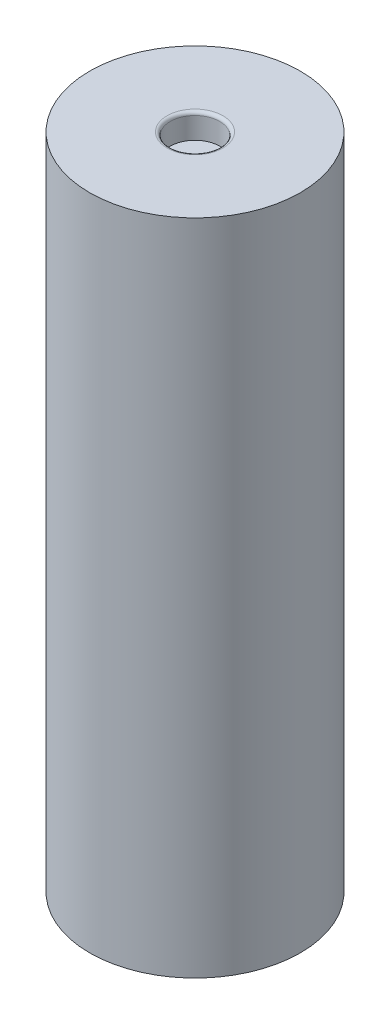
ISO-10303-21;
HEADER;
FILE_DESCRIPTION(('STEP AP214'),'2;1');
FILE_NAME('part.step','',(''),(''),'','','');
FILE_SCHEMA(('AUTOMOTIVE_DESIGN { 1 0 10303 214 1 1 1 1 }'));
ENDSEC;
DATA;
#1=APPLICATION_CONTEXT('core data for automotive mechanical design processes');
#2=APPLICATION_PROTOCOL_DEFINITION('international standard','automotive_design',2000,#1);
#3=PRODUCT_CONTEXT('',#1,'mechanical');
#4=PRODUCT('Part','Part','',(#3));
#5=PRODUCT_RELATED_PRODUCT_CATEGORY('part','',(#4));
#6=PRODUCT_DEFINITION_FORMATION('','',#4);
#7=PRODUCT_DEFINITION_CONTEXT('part definition',#1,'design');
#8=PRODUCT_DEFINITION('design','',#6,#7);
#9=PRODUCT_DEFINITION_SHAPE('','',#8);
#10=(LENGTH_UNIT() NAMED_UNIT(*) SI_UNIT(.MILLI.,.METRE.));
#11=(NAMED_UNIT(*) PLANE_ANGLE_UNIT() SI_UNIT($,.RADIAN.));
#12=(NAMED_UNIT(*) SI_UNIT($,.STERADIAN.) SOLID_ANGLE_UNIT());
#13=UNCERTAINTY_MEASURE_WITH_UNIT(LENGTH_MEASURE(1.E-05),#10,'distance_accuracy_value','');
#14=(GEOMETRIC_REPRESENTATION_CONTEXT(3) GLOBAL_UNCERTAINTY_ASSIGNED_CONTEXT((#13)) GLOBAL_UNIT_ASSIGNED_CONTEXT((#10,
#11,#12)) REPRESENTATION_CONTEXT('',''));
#15=CARTESIAN_POINT('',(0.,0.,0.));
#16=DIRECTION('',(0.,0.,1.));
#17=DIRECTION('',(1.,0.,0.));
#18=AXIS2_PLACEMENT_3D('',#15,#16,#17);
#19=CARTESIAN_POINT('',(0.,40.,0.));
#20=DIRECTION('',(0.,-1.,0.));
#21=DIRECTION('',(0.,0.,-1.));
#22=AXIS2_PLACEMENT_3D('',#19,#20,#21);
#23=CYLINDRICAL_SURFACE('',#22,6.4);
#24=CARTESIAN_POINT('',(0.,40.,0.));
#25=DIRECTION('',(0.,1.,0.));
#26=DIRECTION('',(0.,0.,1.));
#27=AXIS2_PLACEMENT_3D('',#24,#25,#26);
#28=CIRCLE('',#27,6.4);
#29=CARTESIAN_POINT('',(0.,40.,6.4));
#30=VERTEX_POINT('',#29);
#31=EDGE_CURVE('E67',#30,#30,#28,.T.);
#32=ORIENTED_EDGE('',*,*,#31,.F.);
#33=EDGE_LOOP('',(#32));
#34=FACE_BOUND('',#33,.T.);
#35=CARTESIAN_POINT('',(0.,0.,0.));
#36=DIRECTION('',(0.,1.,0.));
#37=DIRECTION('',(0.,0.,1.));
#38=AXIS2_PLACEMENT_3D('',#35,#36,#37);
#39=CIRCLE('',#38,6.4);
#40=CARTESIAN_POINT('',(0.,0.,6.4));
#41=VERTEX_POINT('',#40);
#42=EDGE_CURVE('E68',#41,#41,#39,.T.);
#43=ORIENTED_EDGE('',*,*,#42,.T.);
#44=EDGE_LOOP('',(#43));
#45=FACE_BOUND('',#44,.T.);
#46=ADVANCED_FACE('F43',(#34,#45),#23,.T.);
#47=CARTESIAN_POINT('',(0.,40.,0.));
#48=DIRECTION('',(0.,1.,0.));
#49=DIRECTION('',(0.,0.,1.));
#50=AXIS2_PLACEMENT_3D('',#47,#48,#49);
#51=PLANE('',#50);
#52=CARTESIAN_POINT('',(0.,40.,0.));
#53=DIRECTION('',(0.,1.,0.));
#54=DIRECTION('',(0.,0.,1.));
#55=AXIS2_PLACEMENT_3D('',#52,#53,#54);
#56=CIRCLE('',#55,1.7);
#57=CARTESIAN_POINT('',(0.,40.,1.7));
#58=VERTEX_POINT('',#57);
#59=EDGE_CURVE('E10',#58,#58,#56,.F.);
#60=ORIENTED_EDGE('',*,*,#59,.T.);
#61=EDGE_LOOP('',(#60));
#62=FACE_BOUND('',#61,.T.);
#63=ORIENTED_EDGE('',*,*,#31,.T.);
#64=EDGE_LOOP('',(#63));
#65=FACE_BOUND('',#64,.T.);
#66=ADVANCED_FACE('F101',(#62,#65),#51,.T.);
#67=CARTESIAN_POINT('',(0.,0.,0.));
#68=DIRECTION('',(0.,1.,0.));
#69=DIRECTION('',(0.,0.,1.));
#70=AXIS2_PLACEMENT_3D('',#67,#68,#69);
#71=PLANE('',#70);
#72=CARTESIAN_POINT('',(0.,0.,0.));
#73=DIRECTION('',(0.,1.,0.));
#74=DIRECTION('',(0.,0.,1.));
#75=AXIS2_PLACEMENT_3D('',#72,#73,#74);
#76=CIRCLE('',#75,1.7);
#77=CARTESIAN_POINT('',(0.,0.,1.7));
#78=VERTEX_POINT('',#77);
#79=EDGE_CURVE('E61',#78,#78,#76,.T.);
#80=ORIENTED_EDGE('',*,*,#79,.T.);
#81=EDGE_LOOP('',(#80));
#82=FACE_BOUND('',#81,.T.);
#83=ORIENTED_EDGE('',*,*,#42,.F.);
#84=EDGE_LOOP('',(#83));
#85=FACE_BOUND('',#84,.T.);
#86=ADVANCED_FACE('F106',(#82,#85),#71,.F.);
#87=CARTESIAN_POINT('',(0.,38.5,0.));
#88=DIRECTION('',(0.,1.,0.));
#89=DIRECTION('',(0.,0.,1.));
#90=AXIS2_PLACEMENT_3D('',#87,#88,#89);
#91=CYLINDRICAL_SURFACE('',#90,1.5);
#92=CARTESIAN_POINT('',(0.,39.8,0.));
#93=DIRECTION('',(0.,1.,0.));
#94=DIRECTION('',(0.,0.,1.));
#95=AXIS2_PLACEMENT_3D('',#92,#93,#94);
#96=CIRCLE('',#95,1.5);
#97=CARTESIAN_POINT('',(0.,39.8,1.5));
#98=VERTEX_POINT('',#97);
#99=EDGE_CURVE('E51',#98,#98,#96,.T.);
#100=ORIENTED_EDGE('',*,*,#99,.T.);
#101=EDGE_LOOP('',(#100));
#102=FACE_BOUND('',#101,.T.);
#103=CARTESIAN_POINT('',(0.,38.5,0.));
#104=DIRECTION('',(0.,1.,0.));
#105=DIRECTION('',(0.,0.,1.));
#106=AXIS2_PLACEMENT_3D('',#103,#104,#105);
#107=CIRCLE('',#106,1.5);
#108=CARTESIAN_POINT('',(0.,38.5,1.5));
#109=VERTEX_POINT('',#108);
#110=EDGE_CURVE('E72',#109,#109,#107,.T.);
#111=ORIENTED_EDGE('',*,*,#110,.F.);
#112=EDGE_LOOP('',(#111));
#113=FACE_BOUND('',#112,.T.);
#114=ADVANCED_FACE('F112',(#102,#113),#91,.F.);
#115=CARTESIAN_POINT('',(0.,38.5,0.));
#116=DIRECTION('',(0.,1.,0.));
#117=DIRECTION('',(0.,0.,1.));
#118=AXIS2_PLACEMENT_3D('',#115,#116,#117);
#119=PLANE('',#118);
#120=ORIENTED_EDGE('',*,*,#110,.T.);
#121=EDGE_LOOP('',(#120));
#122=FACE_BOUND('',#121,.T.);
#123=ADVANCED_FACE('F97',(#122),#119,.T.);
#124=CARTESIAN_POINT('',(0.,1.5,0.));
#125=DIRECTION('',(0.,-1.,0.));
#126=DIRECTION('',(0.,0.,-1.));
#127=AXIS2_PLACEMENT_3D('',#124,#125,#126);
#128=CYLINDRICAL_SURFACE('',#127,1.5);
#129=CARTESIAN_POINT('',(0.,0.2,0.));
#130=DIRECTION('',(0.,1.,0.));
#131=DIRECTION('',(0.,0.,1.));
#132=AXIS2_PLACEMENT_3D('',#129,#130,#131);
#133=CIRCLE('',#132,1.5);
#134=CARTESIAN_POINT('',(0.,0.2,1.5));
#135=VERTEX_POINT('',#134);
#136=EDGE_CURVE('E56',#135,#135,#133,.F.);
#137=ORIENTED_EDGE('',*,*,#136,.T.);
#138=EDGE_LOOP('',(#137));
#139=FACE_BOUND('',#138,.T.);
#140=CARTESIAN_POINT('',(0.,1.5,0.));
#141=DIRECTION('',(0.,1.,0.));
#142=DIRECTION('',(0.,0.,1.));
#143=AXIS2_PLACEMENT_3D('',#140,#141,#142);
#144=CIRCLE('',#143,1.5);
#145=CARTESIAN_POINT('',(0.,1.5,1.5));
#146=VERTEX_POINT('',#145);
#147=EDGE_CURVE('E79',#146,#146,#144,.T.);
#148=ORIENTED_EDGE('',*,*,#147,.T.);
#149=EDGE_LOOP('',(#148));
#150=FACE_BOUND('',#149,.T.);
#151=ADVANCED_FACE('F84',(#139,#150),#128,.F.);
#152=CARTESIAN_POINT('',(0.,1.5,0.));
#153=DIRECTION('',(0.,-1.,0.));
#154=DIRECTION('',(0.,0.,1.));
#155=AXIS2_PLACEMENT_3D('',#152,#153,#154);
#156=PLANE('',#155);
#157=ORIENTED_EDGE('',*,*,#147,.F.);
#158=EDGE_LOOP('',(#157));
#159=FACE_BOUND('',#158,.T.);
#160=ADVANCED_FACE('F86',(#159),#156,.T.);
#161=CARTESIAN_POINT('',(0.,0.2,0.));
#162=DIRECTION('',(0.,1.,0.));
#163=DIRECTION('',(0.,0.,1.));
#164=AXIS2_PLACEMENT_3D('',#161,#162,#163);
#165=TOROIDAL_SURFACE('',#164,1.7,0.2);
#166=ORIENTED_EDGE('',*,*,#136,.F.);
#167=EDGE_LOOP('',(#166));
#168=FACE_BOUND('',#167,.T.);
#169=ORIENTED_EDGE('',*,*,#79,.F.);
#170=EDGE_LOOP('',(#169));
#171=FACE_BOUND('',#170,.T.);
#172=ADVANCED_FACE('F88',(#168,#171),#165,.T.);
#173=CARTESIAN_POINT('',(0.,39.8,0.));
#174=DIRECTION('',(0.,1.,0.));
#175=DIRECTION('',(0.,0.,1.));
#176=AXIS2_PLACEMENT_3D('',#173,#174,#175);
#177=TOROIDAL_SURFACE('',#176,1.7,0.2);
#178=ORIENTED_EDGE('',*,*,#59,.F.);
#179=EDGE_LOOP('',(#178));
#180=FACE_BOUND('',#179,.T.);
#181=ORIENTED_EDGE('',*,*,#99,.F.);
#182=EDGE_LOOP('',(#181));
#183=FACE_BOUND('',#182,.T.);
#184=ADVANCED_FACE('F45',(#180,#183),#177,.T.);
#185=CLOSED_SHELL('',(#46,#66,#86,#114,#123,#151,#160,#172,#184));
#186=MANIFOLD_SOLID_BREP('B2',#185);
#187=ADVANCED_BREP_SHAPE_REPRESENTATION('',(#18,#186),#14);
#188=SHAPE_DEFINITION_REPRESENTATION(#9,#187);
ENDSEC;
END-ISO-10303-21;
